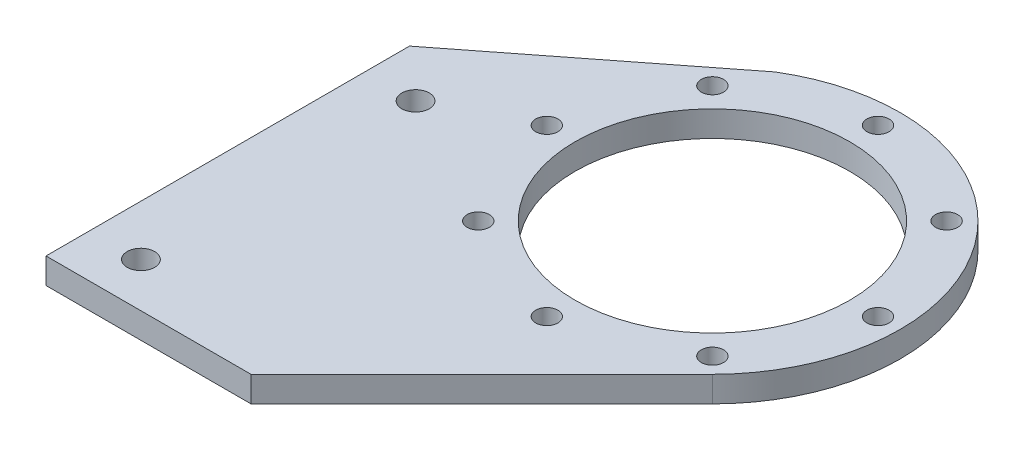
ISO-10303-21;
HEADER;
FILE_DESCRIPTION(('STEP AP214'),'2;1');
FILE_NAME('part.step','',(''),(''),'','','');
FILE_SCHEMA(('AUTOMOTIVE_DESIGN { 1 0 10303 214 1 1 1 1 }'));
ENDSEC;
DATA;
#1=APPLICATION_CONTEXT('core data for automotive mechanical design processes');
#2=APPLICATION_PROTOCOL_DEFINITION('international standard','automotive_design',2000,#1);
#3=PRODUCT_CONTEXT('',#1,'mechanical');
#4=PRODUCT('Part','Part','',(#3));
#5=PRODUCT_RELATED_PRODUCT_CATEGORY('part','',(#4));
#6=PRODUCT_DEFINITION_FORMATION('','',#4);
#7=PRODUCT_DEFINITION_CONTEXT('part definition',#1,'design');
#8=PRODUCT_DEFINITION('design','',#6,#7);
#9=PRODUCT_DEFINITION_SHAPE('','',#8);
#10=(LENGTH_UNIT() NAMED_UNIT(*) SI_UNIT(.MILLI.,.METRE.));
#11=(NAMED_UNIT(*) PLANE_ANGLE_UNIT() SI_UNIT($,.RADIAN.));
#12=(NAMED_UNIT(*) SI_UNIT($,.STERADIAN.) SOLID_ANGLE_UNIT());
#13=UNCERTAINTY_MEASURE_WITH_UNIT(LENGTH_MEASURE(1.E-05),#10,'distance_accuracy_value','');
#14=(GEOMETRIC_REPRESENTATION_CONTEXT(3) GLOBAL_UNCERTAINTY_ASSIGNED_CONTEXT((#13)) GLOBAL_UNIT_ASSIGNED_CONTEXT((#10,
#11,#12)) REPRESENTATION_CONTEXT('',''));
#15=CARTESIAN_POINT('',(0.,0.,0.));
#16=DIRECTION('',(0.,0.,1.));
#17=DIRECTION('',(1.,0.,0.));
#18=AXIS2_PLACEMENT_3D('',#15,#16,#17);
#19=CARTESIAN_POINT('',(0.,-6.35,0.));
#20=DIRECTION('',(-1.,0.,0.));
#21=DIRECTION('',(0.,0.,1.));
#22=AXIS2_PLACEMENT_3D('',#19,#20,#21);
#23=PLANE('',#22);
#24=DIRECTION('',(0.,0.,1.));
#25=VECTOR('',#24,1.);
#26=CARTESIAN_POINT('',(0.,0.,0.));
#27=LINE('',#26,#25);
#28=CARTESIAN_POINT('',(0.,0.,-90.));
#29=VERTEX_POINT('',#28);
#30=CARTESIAN_POINT('',(0.,0.,0.));
#31=VERTEX_POINT('',#30);
#32=EDGE_CURVE('E118',#29,#31,#27,.T.);
#33=ORIENTED_EDGE('',*,*,#32,.F.);
#34=DIRECTION('',(0.,1.,0.));
#35=VECTOR('',#34,1.);
#36=CARTESIAN_POINT('',(0.,-6.35,-90.));
#37=LINE('',#36,#35);
#38=CARTESIAN_POINT('',(0.,-6.35,-90.));
#39=VERTEX_POINT('',#38);
#40=EDGE_CURVE('E11',#39,#29,#37,.T.);
#41=ORIENTED_EDGE('',*,*,#40,.F.);
#42=DIRECTION('',(0.,0.,1.));
#43=VECTOR('',#42,1.);
#44=CARTESIAN_POINT('',(0.,-6.35,0.));
#45=LINE('',#44,#43);
#46=CARTESIAN_POINT('',(0.,-6.35,0.));
#47=VERTEX_POINT('',#46);
#48=EDGE_CURVE('E113',#39,#47,#45,.T.);
#49=ORIENTED_EDGE('',*,*,#48,.T.);
#50=DIRECTION('',(0.,1.,0.));
#51=VECTOR('',#50,1.);
#52=CARTESIAN_POINT('',(0.,-6.35,0.));
#53=LINE('',#52,#51);
#54=EDGE_CURVE('E44',#47,#31,#53,.T.);
#55=ORIENTED_EDGE('',*,*,#54,.T.);
#56=EDGE_LOOP('',(#33,#41,#49,#55));
#57=FACE_BOUND('',#56,.T.);
#58=ADVANCED_FACE('F41',(#57),#23,.T.);
#59=CARTESIAN_POINT('',(0.,-6.35,-90.));
#60=DIRECTION('',(-0.615892028317826,0.,-0.787830571540959));
#61=DIRECTION('',(-0.787830571540959,0.,0.615892028317826));
#62=AXIS2_PLACEMENT_3D('',#59,#60,#61);
#63=PLANE('',#62);
#64=DIRECTION('',(-0.787830571540959,0.,0.615892028317826));
#65=VECTOR('',#64,1.);
#66=CARTESIAN_POINT('',(0.,0.,-90.));
#67=LINE('',#66,#65);
#68=CARTESIAN_POINT('',(50.7609306503487,0.,-129.682710555893));
#69=VERTEX_POINT('',#68);
#70=EDGE_CURVE('E128',#69,#29,#67,.T.);
#71=ORIENTED_EDGE('',*,*,#70,.F.);
#72=DIRECTION('',(0.,1.,0.));
#73=VECTOR('',#72,1.);
#74=CARTESIAN_POINT('',(50.7609306503487,-6.35,-129.682710555893));
#75=LINE('',#74,#73);
#76=CARTESIAN_POINT('',(50.7609306503487,-6.35,-129.682710555893));
#77=VERTEX_POINT('',#76);
#78=EDGE_CURVE('E50',#77,#69,#75,.T.);
#79=ORIENTED_EDGE('',*,*,#78,.F.);
#80=DIRECTION('',(-0.787830571540959,0.,0.615892028317826));
#81=VECTOR('',#80,1.);
#82=CARTESIAN_POINT('',(0.,-6.35,-90.));
#83=LINE('',#82,#81);
#84=EDGE_CURVE('E108',#77,#39,#83,.T.);
#85=ORIENTED_EDGE('',*,*,#84,.T.);
#86=ORIENTED_EDGE('',*,*,#40,.T.);
#87=EDGE_LOOP('',(#71,#79,#85,#86));
#88=FACE_BOUND('',#87,.T.);
#89=ADVANCED_FACE('F134',(#88),#63,.T.);
#90=CARTESIAN_POINT('',(75.,-6.35,-90.));
#91=DIRECTION('',(0.,1.,0.));
#92=DIRECTION('',(0.,0.,1.));
#93=AXIS2_PLACEMENT_3D('',#90,#91,#92);
#94=CYLINDRICAL_SURFACE('',#93,46.5);
#95=CARTESIAN_POINT('',(75.,0.,-90.));
#96=DIRECTION('',(0.,1.,0.));
#97=DIRECTION('',(0.,0.,-1.));
#98=AXIS2_PLACEMENT_3D('',#95,#96,#97);
#99=CIRCLE('',#98,46.5);
#100=CARTESIAN_POINT('',(107.880465325174,0.,-57.1195346748255));
#101=VERTEX_POINT('',#100);
#102=EDGE_CURVE('E97',#101,#69,#99,.T.);
#103=ORIENTED_EDGE('',*,*,#102,.F.);
#104=DIRECTION('',(0.,1.,0.));
#105=VECTOR('',#104,1.);
#106=CARTESIAN_POINT('',(107.880465325174,-6.35,-57.1195346748255));
#107=LINE('',#106,#105);
#108=CARTESIAN_POINT('',(107.880465325174,-6.35,-57.1195346748255));
#109=VERTEX_POINT('',#108);
#110=EDGE_CURVE('E92',#109,#101,#107,.T.);
#111=ORIENTED_EDGE('',*,*,#110,.F.);
#112=CARTESIAN_POINT('',(75.,-6.35,-90.));
#113=DIRECTION('',(0.,1.,0.));
#114=DIRECTION('',(0.,0.,-1.));
#115=AXIS2_PLACEMENT_3D('',#112,#113,#114);
#116=CIRCLE('',#115,46.5);
#117=EDGE_CURVE('E95',#109,#77,#116,.T.);
#118=ORIENTED_EDGE('',*,*,#117,.T.);
#119=ORIENTED_EDGE('',*,*,#78,.T.);
#120=EDGE_LOOP('',(#103,#111,#118,#119));
#121=FACE_BOUND('',#120,.T.);
#122=ADVANCED_FACE('F94',(#121),#94,.T.);
#123=CARTESIAN_POINT('',(107.880465325174,-6.35,-57.1195346748255));
#124=DIRECTION('',(0.707106781186547,0.,0.707106781186548));
#125=DIRECTION('',(0.707106781186548,0.,-0.707106781186547));
#126=AXIS2_PLACEMENT_3D('',#123,#124,#125);
#127=PLANE('',#126);
#128=DIRECTION('',(0.707106781186548,0.,-0.707106781186547));
#129=VECTOR('',#128,1.);
#130=CARTESIAN_POINT('',(107.880465325174,0.,-57.1195346748255));
#131=LINE('',#130,#129);
#132=CARTESIAN_POINT('',(50.7609306503488,0.,0.));
#133=VERTEX_POINT('',#132);
#134=EDGE_CURVE('E125',#133,#101,#131,.T.);
#135=ORIENTED_EDGE('',*,*,#134,.F.);
#136=DIRECTION('',(0.,1.,0.));
#137=VECTOR('',#136,1.);
#138=CARTESIAN_POINT('',(50.7609306503488,-6.35,0.));
#139=LINE('',#138,#137);
#140=CARTESIAN_POINT('',(50.7609306503488,-6.35,0.));
#141=VERTEX_POINT('',#140);
#142=EDGE_CURVE('E102',#141,#133,#139,.T.);
#143=ORIENTED_EDGE('',*,*,#142,.F.);
#144=DIRECTION('',(0.707106781186548,0.,-0.707106781186547));
#145=VECTOR('',#144,1.);
#146=CARTESIAN_POINT('',(107.880465325174,-6.35,-57.1195346748255));
#147=LINE('',#146,#145);
#148=EDGE_CURVE('E107',#141,#109,#147,.T.);
#149=ORIENTED_EDGE('',*,*,#148,.T.);
#150=ORIENTED_EDGE('',*,*,#110,.T.);
#151=EDGE_LOOP('',(#135,#143,#149,#150));
#152=FACE_BOUND('',#151,.T.);
#153=ADVANCED_FACE('F110',(#152),#127,.T.);
#154=CARTESIAN_POINT('',(0.,-6.35,0.));
#155=DIRECTION('',(0.,0.,1.));
#156=DIRECTION('',(1.,0.,0.));
#157=AXIS2_PLACEMENT_3D('',#154,#155,#156);
#158=PLANE('',#157);
#159=DIRECTION('',(1.,0.,0.));
#160=VECTOR('',#159,1.);
#161=CARTESIAN_POINT('',(0.,0.,0.));
#162=LINE('',#161,#160);
#163=EDGE_CURVE('E121',#31,#133,#162,.T.);
#164=ORIENTED_EDGE('',*,*,#163,.F.);
#165=ORIENTED_EDGE('',*,*,#54,.F.);
#166=DIRECTION('',(1.,0.,0.));
#167=VECTOR('',#166,1.);
#168=CARTESIAN_POINT('',(0.,-6.35,0.));
#169=LINE('',#168,#167);
#170=EDGE_CURVE('E111',#47,#141,#169,.T.);
#171=ORIENTED_EDGE('',*,*,#170,.T.);
#172=ORIENTED_EDGE('',*,*,#142,.T.);
#173=EDGE_LOOP('',(#164,#165,#171,#172));
#174=FACE_BOUND('',#173,.T.);
#175=ADVANCED_FACE('F131',(#174),#158,.T.);
#176=CARTESIAN_POINT('',(75.,-6.35,-90.));
#177=DIRECTION('',(0.,-1.,0.));
#178=DIRECTION('',(0.,0.,-1.));
#179=AXIS2_PLACEMENT_3D('',#176,#177,#178);
#180=PLANE('',#179);
#181=CARTESIAN_POINT('',(75.,-6.35,-131.));
#182=DIRECTION('',(0.,1.,0.));
#183=DIRECTION('',(0.,0.,1.));
#184=AXIS2_PLACEMENT_3D('',#181,#182,#183);
#185=CIRCLE('',#184,2.75000000000001);
#186=CARTESIAN_POINT('',(75.,-6.35,-128.25));
#187=VERTEX_POINT('',#186);
#188=EDGE_CURVE('E205',#187,#187,#185,.T.);
#189=ORIENTED_EDGE('',*,*,#188,.T.);
#190=EDGE_LOOP('',(#189));
#191=FACE_BOUND('',#190,.T.);
#192=CARTESIAN_POINT('',(103.991378028648,-6.35,-118.991378028648));
#193=DIRECTION('',(0.,1.,0.));
#194=DIRECTION('',(0.,0.,1.));
#195=AXIS2_PLACEMENT_3D('',#192,#193,#194);
#196=CIRCLE('',#195,2.75000000000001);
#197=CARTESIAN_POINT('',(103.991378028648,-6.35,-116.241378028648));
#198=VERTEX_POINT('',#197);
#199=EDGE_CURVE('E214',#198,#198,#196,.T.);
#200=ORIENTED_EDGE('',*,*,#199,.T.);
#201=EDGE_LOOP('',(#200));
#202=FACE_BOUND('',#201,.T.);
#203=CARTESIAN_POINT('',(116.,-6.35,-90.));
#204=DIRECTION('',(0.,1.,0.));
#205=DIRECTION('',(0.,0.,1.));
#206=AXIS2_PLACEMENT_3D('',#203,#204,#205);
#207=CIRCLE('',#206,2.75000000000001);
#208=CARTESIAN_POINT('',(116.,-6.35,-87.25));
#209=VERTEX_POINT('',#208);
#210=EDGE_CURVE('E222',#209,#209,#207,.T.);
#211=ORIENTED_EDGE('',*,*,#210,.T.);
#212=EDGE_LOOP('',(#211));
#213=FACE_BOUND('',#212,.T.);
#214=CARTESIAN_POINT('',(103.991378028648,-6.35,-61.0086219713515));
#215=DIRECTION('',(0.,1.,0.));
#216=DIRECTION('',(0.,0.,1.));
#217=AXIS2_PLACEMENT_3D('',#214,#215,#216);
#218=CIRCLE('',#217,2.75000000000001);
#219=CARTESIAN_POINT('',(103.991378028648,-6.35,-58.2586219713515));
#220=VERTEX_POINT('',#219);
#221=EDGE_CURVE('E228',#220,#220,#218,.T.);
#222=ORIENTED_EDGE('',*,*,#221,.T.);
#223=EDGE_LOOP('',(#222));
#224=FACE_BOUND('',#223,.T.);
#225=CARTESIAN_POINT('',(75.,-6.35,-49.));
#226=DIRECTION('',(0.,1.,0.));
#227=DIRECTION('',(0.,0.,1.));
#228=AXIS2_PLACEMENT_3D('',#225,#226,#227);
#229=CIRCLE('',#228,2.75000000000001);
#230=CARTESIAN_POINT('',(75.,-6.35,-46.25));
#231=VERTEX_POINT('',#230);
#232=EDGE_CURVE('E234',#231,#231,#229,.T.);
#233=ORIENTED_EDGE('',*,*,#232,.T.);
#234=EDGE_LOOP('',(#233));
#235=FACE_BOUND('',#234,.T.);
#236=CARTESIAN_POINT('',(46.0086219713516,-6.35,-61.0086219713516));
#237=DIRECTION('',(0.,1.,0.));
#238=DIRECTION('',(0.,0.,1.));
#239=AXIS2_PLACEMENT_3D('',#236,#237,#238);
#240=CIRCLE('',#239,2.75);
#241=CARTESIAN_POINT('',(46.0086219713516,-6.35,-58.2586219713516));
#242=VERTEX_POINT('',#241);
#243=EDGE_CURVE('E240',#242,#242,#240,.T.);
#244=ORIENTED_EDGE('',*,*,#243,.T.);
#245=EDGE_LOOP('',(#244));
#246=FACE_BOUND('',#245,.T.);
#247=CARTESIAN_POINT('',(34.,-6.35,-90.));
#248=DIRECTION('',(0.,1.,0.));
#249=DIRECTION('',(0.,0.,1.));
#250=AXIS2_PLACEMENT_3D('',#247,#248,#249);
#251=CIRCLE('',#250,2.75);
#252=CARTESIAN_POINT('',(34.,-6.35,-87.25));
#253=VERTEX_POINT('',#252);
#254=EDGE_CURVE('E246',#253,#253,#251,.T.);
#255=ORIENTED_EDGE('',*,*,#254,.T.);
#256=EDGE_LOOP('',(#255));
#257=FACE_BOUND('',#256,.T.);
#258=CARTESIAN_POINT('',(46.0086219713515,-6.35,-118.991378028648));
#259=DIRECTION('',(0.,1.,0.));
#260=DIRECTION('',(0.,0.,1.));
#261=AXIS2_PLACEMENT_3D('',#258,#259,#260);
#262=CIRCLE('',#261,2.75);
#263=CARTESIAN_POINT('',(46.0086219713515,-6.35,-116.241378028648));
#264=VERTEX_POINT('',#263);
#265=EDGE_CURVE('E252',#264,#264,#262,.T.);
#266=ORIENTED_EDGE('',*,*,#265,.T.);
#267=EDGE_LOOP('',(#266));
#268=FACE_BOUND('',#267,.T.);
#269=CARTESIAN_POINT('',(75.,-6.35,-90.));
#270=DIRECTION('',(0.,1.,0.));
#271=DIRECTION('',(0.,0.,1.));
#272=AXIS2_PLACEMENT_3D('',#269,#270,#271);
#273=CIRCLE('',#272,34.);
#274=CARTESIAN_POINT('',(75.,-6.35,-56.));
#275=VERTEX_POINT('',#274);
#276=EDGE_CURVE('E255',#275,#275,#273,.T.);
#277=ORIENTED_EDGE('',*,*,#276,.T.);
#278=EDGE_LOOP('',(#277));
#279=FACE_BOUND('',#278,.T.);
#280=CARTESIAN_POINT('',(12.5,-6.35,-79.));
#281=DIRECTION('',(0.,1.,0.));
#282=DIRECTION('',(0.,0.,1.));
#283=AXIS2_PLACEMENT_3D('',#280,#281,#282);
#284=CIRCLE('',#283,3.4);
#285=CARTESIAN_POINT('',(12.5,-6.35,-75.6));
#286=VERTEX_POINT('',#285);
#287=EDGE_CURVE('E122',#286,#286,#284,.T.);
#288=ORIENTED_EDGE('',*,*,#287,.T.);
#289=EDGE_LOOP('',(#288));
#290=FACE_BOUND('',#289,.T.);
#291=CARTESIAN_POINT('',(12.5,-6.35,-11.));
#292=DIRECTION('',(0.,1.,0.));
#293=DIRECTION('',(0.,0.,-1.));
#294=AXIS2_PLACEMENT_3D('',#291,#292,#293);
#295=CIRCLE('',#294,3.4);
#296=CARTESIAN_POINT('',(12.5,-6.35,-14.4));
#297=VERTEX_POINT('',#296);
#298=EDGE_CURVE('E258',#297,#297,#295,.T.);
#299=ORIENTED_EDGE('',*,*,#298,.T.);
#300=EDGE_LOOP('',(#299));
#301=FACE_BOUND('',#300,.T.);
#302=ORIENTED_EDGE('',*,*,#48,.F.);
#303=ORIENTED_EDGE('',*,*,#84,.F.);
#304=ORIENTED_EDGE('',*,*,#117,.F.);
#305=ORIENTED_EDGE('',*,*,#148,.F.);
#306=ORIENTED_EDGE('',*,*,#170,.F.);
#307=EDGE_LOOP('',(#302,#303,#304,#305,#306));
#308=FACE_BOUND('',#307,.T.);
#309=ADVANCED_FACE('F106',(#191,#202,#213,#224,#235,#246,#257,#268,#279,#290,#301,#308),#180,.T.);
#310=CARTESIAN_POINT('',(75.,0.,-90.));
#311=DIRECTION('',(0.,-1.,0.));
#312=DIRECTION('',(0.,0.,-1.));
#313=AXIS2_PLACEMENT_3D('',#310,#311,#312);
#314=PLANE('',#313);
#315=CARTESIAN_POINT('',(75.,0.,-131.));
#316=DIRECTION('',(0.,1.,0.));
#317=DIRECTION('',(0.,0.,1.));
#318=AXIS2_PLACEMENT_3D('',#315,#316,#317);
#319=CIRCLE('',#318,2.75000000000001);
#320=CARTESIAN_POINT('',(75.,0.,-128.25));
#321=VERTEX_POINT('',#320);
#322=EDGE_CURVE('E208',#321,#321,#319,.T.);
#323=ORIENTED_EDGE('',*,*,#322,.F.);
#324=EDGE_LOOP('',(#323));
#325=FACE_BOUND('',#324,.T.);
#326=CARTESIAN_POINT('',(103.991378028648,0.,-118.991378028648));
#327=DIRECTION('',(0.,1.,0.));
#328=DIRECTION('',(0.,0.,1.));
#329=AXIS2_PLACEMENT_3D('',#326,#327,#328);
#330=CIRCLE('',#329,2.75000000000001);
#331=CARTESIAN_POINT('',(103.991378028648,0.,-116.241378028648));
#332=VERTEX_POINT('',#331);
#333=EDGE_CURVE('E209',#332,#332,#330,.T.);
#334=ORIENTED_EDGE('',*,*,#333,.F.);
#335=EDGE_LOOP('',(#334));
#336=FACE_BOUND('',#335,.T.);
#337=CARTESIAN_POINT('',(116.,0.,-90.));
#338=DIRECTION('',(0.,1.,0.));
#339=DIRECTION('',(0.,0.,1.));
#340=AXIS2_PLACEMENT_3D('',#337,#338,#339);
#341=CIRCLE('',#340,2.75000000000001);
#342=CARTESIAN_POINT('',(116.,0.,-87.25));
#343=VERTEX_POINT('',#342);
#344=EDGE_CURVE('E219',#343,#343,#341,.T.);
#345=ORIENTED_EDGE('',*,*,#344,.F.);
#346=EDGE_LOOP('',(#345));
#347=FACE_BOUND('',#346,.T.);
#348=CARTESIAN_POINT('',(103.991378028648,0.,-61.0086219713515));
#349=DIRECTION('',(0.,1.,0.));
#350=DIRECTION('',(0.,0.,1.));
#351=AXIS2_PLACEMENT_3D('',#348,#349,#350);
#352=CIRCLE('',#351,2.75000000000001);
#353=CARTESIAN_POINT('',(103.991378028648,0.,-58.2586219713515));
#354=VERTEX_POINT('',#353);
#355=EDGE_CURVE('E225',#354,#354,#352,.T.);
#356=ORIENTED_EDGE('',*,*,#355,.F.);
#357=EDGE_LOOP('',(#356));
#358=FACE_BOUND('',#357,.T.);
#359=CARTESIAN_POINT('',(75.,0.,-49.));
#360=DIRECTION('',(0.,1.,0.));
#361=DIRECTION('',(0.,0.,1.));
#362=AXIS2_PLACEMENT_3D('',#359,#360,#361);
#363=CIRCLE('',#362,2.75000000000001);
#364=CARTESIAN_POINT('',(75.,0.,-46.25));
#365=VERTEX_POINT('',#364);
#366=EDGE_CURVE('E231',#365,#365,#363,.T.);
#367=ORIENTED_EDGE('',*,*,#366,.F.);
#368=EDGE_LOOP('',(#367));
#369=FACE_BOUND('',#368,.T.);
#370=CARTESIAN_POINT('',(46.0086219713516,0.,-61.0086219713516));
#371=DIRECTION('',(0.,1.,0.));
#372=DIRECTION('',(0.,0.,1.));
#373=AXIS2_PLACEMENT_3D('',#370,#371,#372);
#374=CIRCLE('',#373,2.75);
#375=CARTESIAN_POINT('',(46.0086219713516,0.,-58.2586219713516));
#376=VERTEX_POINT('',#375);
#377=EDGE_CURVE('E237',#376,#376,#374,.T.);
#378=ORIENTED_EDGE('',*,*,#377,.F.);
#379=EDGE_LOOP('',(#378));
#380=FACE_BOUND('',#379,.T.);
#381=CARTESIAN_POINT('',(34.,0.,-90.));
#382=DIRECTION('',(0.,1.,0.));
#383=DIRECTION('',(0.,0.,1.));
#384=AXIS2_PLACEMENT_3D('',#381,#382,#383);
#385=CIRCLE('',#384,2.75);
#386=CARTESIAN_POINT('',(34.,0.,-87.25));
#387=VERTEX_POINT('',#386);
#388=EDGE_CURVE('E243',#387,#387,#385,.T.);
#389=ORIENTED_EDGE('',*,*,#388,.F.);
#390=EDGE_LOOP('',(#389));
#391=FACE_BOUND('',#390,.T.);
#392=CARTESIAN_POINT('',(46.0086219713515,0.,-118.991378028648));
#393=DIRECTION('',(0.,1.,0.));
#394=DIRECTION('',(0.,0.,1.));
#395=AXIS2_PLACEMENT_3D('',#392,#393,#394);
#396=CIRCLE('',#395,2.75);
#397=CARTESIAN_POINT('',(46.0086219713515,0.,-116.241378028648));
#398=VERTEX_POINT('',#397);
#399=EDGE_CURVE('E249',#398,#398,#396,.T.);
#400=ORIENTED_EDGE('',*,*,#399,.F.);
#401=EDGE_LOOP('',(#400));
#402=FACE_BOUND('',#401,.T.);
#403=CARTESIAN_POINT('',(75.,0.,-90.));
#404=DIRECTION('',(0.,1.,0.));
#405=DIRECTION('',(0.,0.,1.));
#406=AXIS2_PLACEMENT_3D('',#403,#404,#405);
#407=CIRCLE('',#406,34.);
#408=CARTESIAN_POINT('',(75.,0.,-56.));
#409=VERTEX_POINT('',#408);
#410=EDGE_CURVE('E211',#409,#409,#407,.T.);
#411=ORIENTED_EDGE('',*,*,#410,.F.);
#412=EDGE_LOOP('',(#411));
#413=FACE_BOUND('',#412,.T.);
#414=CARTESIAN_POINT('',(12.5,0.,-79.));
#415=DIRECTION('',(0.,1.,0.));
#416=DIRECTION('',(0.,0.,1.));
#417=AXIS2_PLACEMENT_3D('',#414,#415,#416);
#418=CIRCLE('',#417,3.4);
#419=CARTESIAN_POINT('',(12.5,0.,-75.6));
#420=VERTEX_POINT('',#419);
#421=EDGE_CURVE('E263',#420,#420,#418,.T.);
#422=ORIENTED_EDGE('',*,*,#421,.F.);
#423=EDGE_LOOP('',(#422));
#424=FACE_BOUND('',#423,.T.);
#425=CARTESIAN_POINT('',(12.5,0.,-11.));
#426=DIRECTION('',(0.,1.,0.));
#427=DIRECTION('',(0.,0.,-1.));
#428=AXIS2_PLACEMENT_3D('',#425,#426,#427);
#429=CIRCLE('',#428,3.4);
#430=CARTESIAN_POINT('',(12.5,0.,-14.4));
#431=VERTEX_POINT('',#430);
#432=EDGE_CURVE('E266',#431,#431,#429,.T.);
#433=ORIENTED_EDGE('',*,*,#432,.F.);
#434=EDGE_LOOP('',(#433));
#435=FACE_BOUND('',#434,.T.);
#436=ORIENTED_EDGE('',*,*,#32,.T.);
#437=ORIENTED_EDGE('',*,*,#163,.T.);
#438=ORIENTED_EDGE('',*,*,#134,.T.);
#439=ORIENTED_EDGE('',*,*,#102,.T.);
#440=ORIENTED_EDGE('',*,*,#70,.T.);
#441=EDGE_LOOP('',(#436,#437,#438,#439,#440));
#442=FACE_BOUND('',#441,.T.);
#443=ADVANCED_FACE('F133',(#325,#336,#347,#358,#369,#380,#391,#402,#413,#424,#435,#442),#314,.F.);
#444=CARTESIAN_POINT('',(12.5,-6.35,-11.));
#445=DIRECTION('',(0.,1.,0.));
#446=DIRECTION('',(0.,0.,1.));
#447=AXIS2_PLACEMENT_3D('',#444,#445,#446);
#448=CYLINDRICAL_SURFACE('',#447,3.4);
#449=ORIENTED_EDGE('',*,*,#298,.F.);
#450=EDGE_LOOP('',(#449));
#451=FACE_BOUND('',#450,.T.);
#452=ORIENTED_EDGE('',*,*,#432,.T.);
#453=EDGE_LOOP('',(#452));
#454=FACE_BOUND('',#453,.T.);
#455=ADVANCED_FACE('F154',(#451,#454),#448,.F.);
#456=CARTESIAN_POINT('',(12.5,-6.35,-79.));
#457=DIRECTION('',(0.,1.,0.));
#458=DIRECTION('',(0.,0.,1.));
#459=AXIS2_PLACEMENT_3D('',#456,#457,#458);
#460=CYLINDRICAL_SURFACE('',#459,3.4);
#461=ORIENTED_EDGE('',*,*,#287,.F.);
#462=EDGE_LOOP('',(#461));
#463=FACE_BOUND('',#462,.T.);
#464=ORIENTED_EDGE('',*,*,#421,.T.);
#465=EDGE_LOOP('',(#464));
#466=FACE_BOUND('',#465,.T.);
#467=ADVANCED_FACE('F161',(#463,#466),#460,.F.);
#468=CARTESIAN_POINT('',(75.,-6.35,-90.));
#469=DIRECTION('',(0.,1.,0.));
#470=DIRECTION('',(0.,0.,1.));
#471=AXIS2_PLACEMENT_3D('',#468,#469,#470);
#472=CYLINDRICAL_SURFACE('',#471,34.);
#473=ORIENTED_EDGE('',*,*,#276,.F.);
#474=EDGE_LOOP('',(#473));
#475=FACE_BOUND('',#474,.T.);
#476=ORIENTED_EDGE('',*,*,#410,.T.);
#477=EDGE_LOOP('',(#476));
#478=FACE_BOUND('',#477,.T.);
#479=ADVANCED_FACE('F165',(#475,#478),#472,.F.);
#480=CARTESIAN_POINT('',(46.0086219713515,-6.35,-118.991378028648));
#481=DIRECTION('',(0.,1.,0.));
#482=DIRECTION('',(0.,0.,1.));
#483=AXIS2_PLACEMENT_3D('',#480,#481,#482);
#484=CYLINDRICAL_SURFACE('',#483,2.75);
#485=ORIENTED_EDGE('',*,*,#265,.F.);
#486=EDGE_LOOP('',(#485));
#487=FACE_BOUND('',#486,.T.);
#488=ORIENTED_EDGE('',*,*,#399,.T.);
#489=EDGE_LOOP('',(#488));
#490=FACE_BOUND('',#489,.T.);
#491=ADVANCED_FACE('F169',(#487,#490),#484,.F.);
#492=CARTESIAN_POINT('',(34.,-6.35,-90.));
#493=DIRECTION('',(0.,1.,0.));
#494=DIRECTION('',(0.,0.,1.));
#495=AXIS2_PLACEMENT_3D('',#492,#493,#494);
#496=CYLINDRICAL_SURFACE('',#495,2.75);
#497=ORIENTED_EDGE('',*,*,#254,.F.);
#498=EDGE_LOOP('',(#497));
#499=FACE_BOUND('',#498,.T.);
#500=ORIENTED_EDGE('',*,*,#388,.T.);
#501=EDGE_LOOP('',(#500));
#502=FACE_BOUND('',#501,.T.);
#503=ADVANCED_FACE('F173',(#499,#502),#496,.F.);
#504=CARTESIAN_POINT('',(46.0086219713516,-6.35,-61.0086219713516));
#505=DIRECTION('',(0.,1.,0.));
#506=DIRECTION('',(0.,0.,1.));
#507=AXIS2_PLACEMENT_3D('',#504,#505,#506);
#508=CYLINDRICAL_SURFACE('',#507,2.75);
#509=ORIENTED_EDGE('',*,*,#243,.F.);
#510=EDGE_LOOP('',(#509));
#511=FACE_BOUND('',#510,.T.);
#512=ORIENTED_EDGE('',*,*,#377,.T.);
#513=EDGE_LOOP('',(#512));
#514=FACE_BOUND('',#513,.T.);
#515=ADVANCED_FACE('F177',(#511,#514),#508,.F.);
#516=CARTESIAN_POINT('',(75.,-6.35,-49.));
#517=DIRECTION('',(0.,1.,0.));
#518=DIRECTION('',(0.,0.,1.));
#519=AXIS2_PLACEMENT_3D('',#516,#517,#518);
#520=CYLINDRICAL_SURFACE('',#519,2.75000000000001);
#521=ORIENTED_EDGE('',*,*,#232,.F.);
#522=EDGE_LOOP('',(#521));
#523=FACE_BOUND('',#522,.T.);
#524=ORIENTED_EDGE('',*,*,#366,.T.);
#525=EDGE_LOOP('',(#524));
#526=FACE_BOUND('',#525,.T.);
#527=ADVANCED_FACE('F181',(#523,#526),#520,.F.);
#528=CARTESIAN_POINT('',(103.991378028648,-6.35,-61.0086219713515));
#529=DIRECTION('',(0.,1.,0.));
#530=DIRECTION('',(0.,0.,1.));
#531=AXIS2_PLACEMENT_3D('',#528,#529,#530);
#532=CYLINDRICAL_SURFACE('',#531,2.75000000000001);
#533=ORIENTED_EDGE('',*,*,#221,.F.);
#534=EDGE_LOOP('',(#533));
#535=FACE_BOUND('',#534,.T.);
#536=ORIENTED_EDGE('',*,*,#355,.T.);
#537=EDGE_LOOP('',(#536));
#538=FACE_BOUND('',#537,.T.);
#539=ADVANCED_FACE('F185',(#535,#538),#532,.F.);
#540=CARTESIAN_POINT('',(116.,-6.35,-90.));
#541=DIRECTION('',(0.,1.,0.));
#542=DIRECTION('',(0.,0.,1.));
#543=AXIS2_PLACEMENT_3D('',#540,#541,#542);
#544=CYLINDRICAL_SURFACE('',#543,2.75000000000001);
#545=ORIENTED_EDGE('',*,*,#210,.F.);
#546=EDGE_LOOP('',(#545));
#547=FACE_BOUND('',#546,.T.);
#548=ORIENTED_EDGE('',*,*,#344,.T.);
#549=EDGE_LOOP('',(#548));
#550=FACE_BOUND('',#549,.T.);
#551=ADVANCED_FACE('F189',(#547,#550),#544,.F.);
#552=CARTESIAN_POINT('',(103.991378028648,-6.35,-118.991378028648));
#553=DIRECTION('',(0.,1.,0.));
#554=DIRECTION('',(0.,0.,1.));
#555=AXIS2_PLACEMENT_3D('',#552,#553,#554);
#556=CYLINDRICAL_SURFACE('',#555,2.75000000000001);
#557=ORIENTED_EDGE('',*,*,#199,.F.);
#558=EDGE_LOOP('',(#557));
#559=FACE_BOUND('',#558,.T.);
#560=ORIENTED_EDGE('',*,*,#333,.T.);
#561=EDGE_LOOP('',(#560));
#562=FACE_BOUND('',#561,.T.);
#563=ADVANCED_FACE('F193',(#559,#562),#556,.F.);
#564=CARTESIAN_POINT('',(75.,-6.35,-131.));
#565=DIRECTION('',(0.,1.,0.));
#566=DIRECTION('',(0.,0.,1.));
#567=AXIS2_PLACEMENT_3D('',#564,#565,#566);
#568=CYLINDRICAL_SURFACE('',#567,2.75000000000001);
#569=ORIENTED_EDGE('',*,*,#188,.F.);
#570=EDGE_LOOP('',(#569));
#571=FACE_BOUND('',#570,.T.);
#572=ORIENTED_EDGE('',*,*,#322,.T.);
#573=EDGE_LOOP('',(#572));
#574=FACE_BOUND('',#573,.T.);
#575=ADVANCED_FACE('F197',(#571,#574),#568,.F.);
#576=CLOSED_SHELL('',(#58,#89,#122,#153,#175,#309,#443,#455,#467,#479,#491,#503,#515,#527,#539,
#551,#563,#575));
#577=MANIFOLD_SOLID_BREP('B2',#576);
#578=ADVANCED_BREP_SHAPE_REPRESENTATION('',(#18,#577),#14);
#579=SHAPE_DEFINITION_REPRESENTATION(#9,#578);
ENDSEC;
END-ISO-10303-21;
